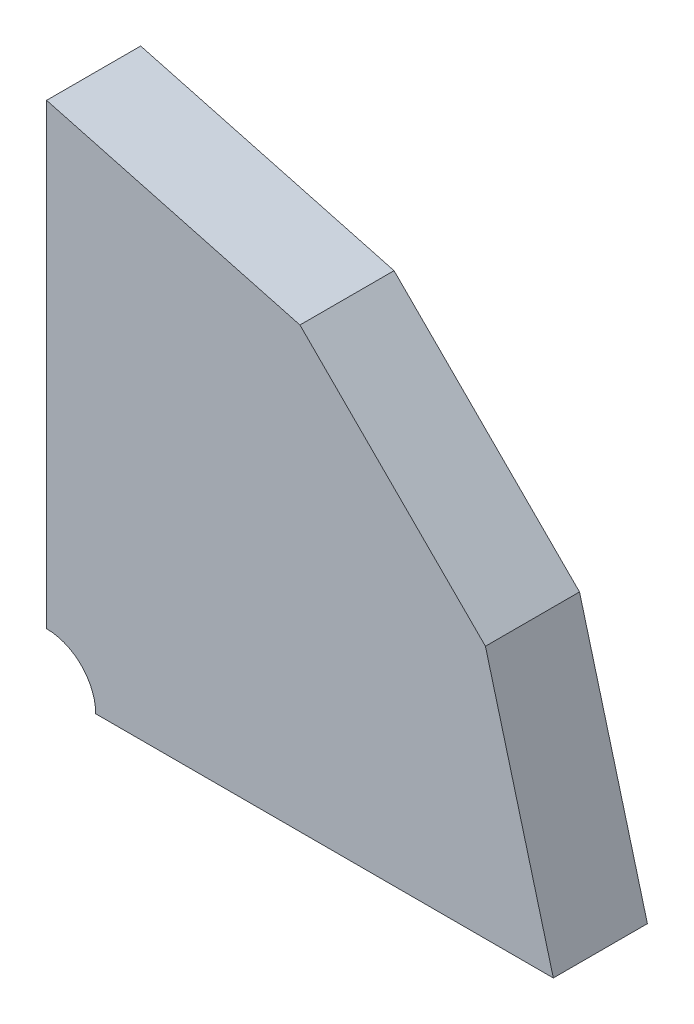
ISO-10303-21;
HEADER;
FILE_DESCRIPTION(('STEP AP214'),'2;1');
FILE_NAME('part.step','',(''),(''),'','','');
FILE_SCHEMA(('AUTOMOTIVE_DESIGN { 1 0 10303 214 1 1 1 1 }'));
ENDSEC;
DATA;
#1=APPLICATION_CONTEXT('core data for automotive mechanical design processes');
#2=APPLICATION_PROTOCOL_DEFINITION('international standard','automotive_design',2000,#1);
#3=PRODUCT_CONTEXT('',#1,'mechanical');
#4=PRODUCT('Part','Part','',(#3));
#5=PRODUCT_RELATED_PRODUCT_CATEGORY('part','',(#4));
#6=PRODUCT_DEFINITION_FORMATION('','',#4);
#7=PRODUCT_DEFINITION_CONTEXT('part definition',#1,'design');
#8=PRODUCT_DEFINITION('design','',#6,#7);
#9=PRODUCT_DEFINITION_SHAPE('','',#8);
#10=(LENGTH_UNIT() NAMED_UNIT(*) SI_UNIT(.MILLI.,.METRE.));
#11=(NAMED_UNIT(*) PLANE_ANGLE_UNIT() SI_UNIT($,.RADIAN.));
#12=(NAMED_UNIT(*) SI_UNIT($,.STERADIAN.) SOLID_ANGLE_UNIT());
#13=UNCERTAINTY_MEASURE_WITH_UNIT(LENGTH_MEASURE(1.E-05),#10,'distance_accuracy_value','');
#14=(GEOMETRIC_REPRESENTATION_CONTEXT(3) GLOBAL_UNCERTAINTY_ASSIGNED_CONTEXT((#13)) GLOBAL_UNIT_ASSIGNED_CONTEXT((#10,
#11,#12)) REPRESENTATION_CONTEXT('',''));
#15=CARTESIAN_POINT('',(0.,0.,0.));
#16=DIRECTION('',(0.,0.,1.));
#17=DIRECTION('',(1.,0.,0.));
#18=AXIS2_PLACEMENT_3D('',#15,#16,#17);
#19=CARTESIAN_POINT('',(-2.06853544642894E-11,-3.93812871202215E-07,1188.2200000819));
#20=DIRECTION('',(0.,0.,-1.));
#21=DIRECTION('',(-0.499999999999983,-0.866025403784448,0.));
#22=AXIS2_PLACEMENT_3D('',#19,#20,#21);
#23=CYLINDRICAL_SURFACE('',#22,533.4);
#24=DIRECTION('',(0.,0.,-1.));
#25=VECTOR('',#24,1.);
#26=CARTESIAN_POINT('',(533.399999999979,-3.81675066500359E-08,1188.2200000819));
#27=LINE('',#26,#25);
#28=CARTESIAN_POINT('',(533.399999999979,-3.81741830528863E-08,213.220000081901));
#29=VERTEX_POINT('',#28);
#30=CARTESIAN_POINT('',(533.399999999979,-3.81873867180188E-08,-1714.9999999181));
#31=VERTEX_POINT('',#30);
#32=EDGE_CURVE('E110',#29,#31,#27,.T.);
#33=ORIENTED_EDGE('',*,*,#32,.F.);
#34=CARTESIAN_POINT('',(-2.06853544642894E-11,-3.9381627539652E-07,213.220000081901));
#35=DIRECTION('',(0.,0.,-1.));
#36=DIRECTION('',(-1.,0.,0.));
#37=AXIS2_PLACEMENT_3D('',#34,#35,#36);
#38=CIRCLE('',#37,533.4);
#39=CARTESIAN_POINT('',(-5.37423249022792E-12,533.399999606184,213.220000081901));
#40=VERTEX_POINT('',#39);
#41=EDGE_CURVE('E57',#29,#40,#38,.F.);
#42=ORIENTED_EDGE('',*,*,#41,.T.);
#43=DIRECTION('',(0.,0.,-1.));
#44=VECTOR('',#43,1.);
#45=CARTESIAN_POINT('',(-3.46668881973511E-12,533.399999606187,1188.2200000819));
#46=LINE('',#45,#44);
#47=CARTESIAN_POINT('',(-9.14670824029732E-12,533.399999606177,-1714.9999999181));
#48=VERTEX_POINT('',#47);
#49=EDGE_CURVE('E198',#40,#48,#46,.T.);
#50=ORIENTED_EDGE('',*,*,#49,.T.);
#51=CARTESIAN_POINT('',(-2.06853544642893E-11,-3.93822974231739E-07,-1714.9999999181));
#52=DIRECTION('',(0.,0.,1.));
#53=DIRECTION('',(1.,0.,0.));
#54=AXIS2_PLACEMENT_3D('',#51,#52,#53);
#55=CIRCLE('',#54,533.4);
#56=EDGE_CURVE('E118',#48,#31,#55,.F.);
#57=ORIENTED_EDGE('',*,*,#56,.T.);
#58=EDGE_LOOP('',(#33,#42,#50,#57));
#59=FACE_BOUND('',#58,.T.);
#60=ADVANCED_FACE('F43',(#59),#23,.F.);
#61=CARTESIAN_POINT('',(-2.06886671161642E-11,-3.93822974231739E-07,-1714.9999999181));
#62=DIRECTION('',(0.,0.,1.));
#63=DIRECTION('',(1.,0.,0.));
#64=AXIS2_PLACEMENT_3D('',#61,#62,#63);
#65=PLANE('',#64);
#66=DIRECTION('',(1.,-7.15703845080556E-11,0.));
#67=VECTOR('',#66,1.);
#68=CARTESIAN_POINT('',(-2.0688638930943E-11,-1.17436214219295E-11,-1714.9999999181));
#69=LINE('',#68,#67);
#70=CARTESIAN_POINT('',(953.789538374289,-6.82746417592828E-08,-1714.9999999181));
#71=VERTEX_POINT('',#70);
#72=EDGE_CURVE('E120',#31,#71,#69,.T.);
#73=ORIENTED_EDGE('',*,*,#72,.F.);
#74=ORIENTED_EDGE('',*,*,#56,.F.);
#75=DIRECTION('',(0.,1.,0.));
#76=VECTOR('',#75,1.);
#77=CARTESIAN_POINT('',(-3.35532040058464E-12,-3.93822974231739E-07,-1714.9999999181));
#78=LINE('',#77,#76);
#79=CARTESIAN_POINT('',(-1.35509246747983E-11,953.789538067719,-1714.9999999181));
#80=VERTEX_POINT('',#79);
#81=EDGE_CURVE('E119',#48,#80,#78,.T.);
#82=ORIENTED_EDGE('',*,*,#81,.T.);
#83=DIRECTION('',(-0.965925826289072,0.258819045102508,0.));
#84=VECTOR('',#83,1.);
#85=CARTESIAN_POINT('',(-1136.96261538466,1258.43775268439,-1714.9999999181));
#86=LINE('',#85,#84);
#87=CARTESIAN_POINT('',(476.894769230738,826.005969777712,-1714.9999999181));
#88=VERTEX_POINT('',#87);
#89=EDGE_CURVE('E157',#88,#80,#86,.T.);
#90=ORIENTED_EDGE('',*,*,#89,.F.);
#91=DIRECTION('',(-0.707106781186556,0.707106781186539,0.));
#92=VECTOR('',#91,1.);
#93=CARTESIAN_POINT('',(-355.419631537206,1658.32037054564,-1714.9999999181));
#94=LINE('',#93,#92);
#95=CARTESIAN_POINT('',(826.005970171503,476.894768836957,-1714.9999999181));
#96=VERTEX_POINT('',#95);
#97=EDGE_CURVE('E148',#96,#88,#94,.T.);
#98=ORIENTED_EDGE('',*,*,#97,.F.);
#99=DIRECTION('',(-0.258819045102531,0.965925826289066,0.));
#100=VECTOR('',#99,1.);
#101=CARTESIAN_POINT('',(521.357755554805,1613.85738422157,-1714.9999999181));
#102=LINE('',#101,#100);
#103=EDGE_CURVE('E137',#71,#96,#102,.T.);
#104=ORIENTED_EDGE('',*,*,#103,.F.);
#105=EDGE_LOOP('',(#73,#74,#82,#90,#98,#104));
#106=FACE_BOUND('',#105,.T.);
#107=ADVANCED_FACE('F182',(#106),#65,.F.);
#108=CARTESIAN_POINT('',(0.,0.,213.220000081901));
#109=DIRECTION('',(0.,0.,-1.));
#110=DIRECTION('',(-1.,0.,0.));
#111=AXIS2_PLACEMENT_3D('',#108,#109,#110);
#112=PLANE('',#111);
#113=DIRECTION('',(-1.,7.15703845080556E-11,0.));
#114=VECTOR('',#113,1.);
#115=CARTESIAN_POINT('',(0.,1.46004370910642E-12,213.220000081901));
#116=LINE('',#115,#114);
#117=CARTESIAN_POINT('',(5501.63999999998,-3.93753030181189E-07,213.220000081901));
#118=VERTEX_POINT('',#117);
#119=EDGE_CURVE('E12',#118,#29,#116,.T.);
#120=ORIENTED_EDGE('',*,*,#119,.F.);
#121=DIRECTION('',(0.258819045102532,-0.965925826289066,0.));
#122=VECTOR('',#121,1.);
#123=CARTESIAN_POINT('',(4764.56000247657,2750.81999960624,213.220000081901));
#124=LINE('',#123,#122);
#125=CARTESIAN_POINT('',(4764.56000247657,2750.81999960625,213.220000081901));
#126=VERTEX_POINT('',#125);
#127=EDGE_CURVE('E200',#126,#118,#124,.T.);
#128=ORIENTED_EDGE('',*,*,#127,.F.);
#129=DIRECTION('',(0.707106781186556,-0.707106781186539,0.));
#130=VECTOR('',#129,1.);
#131=CARTESIAN_POINT('',(2750.81999999992,4764.56000208284,213.220000081901));
#132=LINE('',#131,#130);
#133=CARTESIAN_POINT('',(2750.81999999992,4764.56000208284,213.220000081901));
#134=VERTEX_POINT('',#133);
#135=EDGE_CURVE('E131',#134,#126,#132,.T.);
#136=ORIENTED_EDGE('',*,*,#135,.F.);
#137=DIRECTION('',(0.965925826289072,-0.258819045102508,0.));
#138=VECTOR('',#137,1.);
#139=CARTESIAN_POINT('',(-9.83718966127641E-11,5501.63999960618,213.220000081901));
#140=LINE('',#139,#138);
#141=CARTESIAN_POINT('',(-5.93168735115517E-11,5501.63999960618,213.220000081901));
#142=VERTEX_POINT('',#141);
#143=EDGE_CURVE('E126',#142,#134,#140,.T.);
#144=ORIENTED_EDGE('',*,*,#143,.F.);
#145=DIRECTION('',(0.,-1.,0.));
#146=VECTOR('',#145,1.);
#147=CARTESIAN_POINT('',(4.17155345208901E-13,0.,213.220000081901));
#148=LINE('',#147,#146);
#149=EDGE_CURVE('E50',#142,#40,#148,.T.);
#150=ORIENTED_EDGE('',*,*,#149,.T.);
#151=ORIENTED_EDGE('',*,*,#41,.F.);
#152=EDGE_LOOP('',(#120,#128,#136,#144,#150,#151));
#153=FACE_BOUND('',#152,.T.);
#154=ADVANCED_FACE('F123',(#153),#112,.F.);
#155=CARTESIAN_POINT('',(-9.75208480364212E-11,5501.63999960619,1188.22000008188));
#156=DIRECTION('',(-0.258819045102508,-0.965925826289072,0.));
#157=DIRECTION('',(0.965925826289072,-0.258819045102508,0.));
#158=AXIS2_PLACEMENT_3D('',#155,#156,#157);
#159=PLANE('',#158);
#160=DIRECTION('',(0.,0.,-1.));
#161=VECTOR('',#160,1.);
#162=CARTESIAN_POINT('',(-9.9515219346711E-11,5501.63999960619,1188.22000008188));
#163=LINE('',#162,#161);
#164=CARTESIAN_POINT('',(-6.13152749544113E-11,5501.63999960617,-808.219999918121));
#165=VERTEX_POINT('',#164);
#166=EDGE_CURVE('E163',#142,#165,#163,.T.);
#167=ORIENTED_EDGE('',*,*,#166,.F.);
#168=ORIENTED_EDGE('',*,*,#143,.T.);
#169=DIRECTION('',(0.,0.,-1.));
#170=VECTOR('',#169,1.);
#171=CARTESIAN_POINT('',(2750.81999999992,4764.56000208284,1188.22000008188));
#172=LINE('',#171,#170);
#173=CARTESIAN_POINT('',(2750.81999999992,4764.56000208284,-808.219999918117));
#174=VERTEX_POINT('',#173);
#175=EDGE_CURVE('E65',#134,#174,#172,.T.);
#176=ORIENTED_EDGE('',*,*,#175,.T.);
#177=DIRECTION('',(0.965925826289072,-0.258819045102508,0.));
#178=VECTOR('',#177,1.);
#179=CARTESIAN_POINT('',(-9.77428926413461E-11,5501.63999960618,-808.21999991812));
#180=LINE('',#179,#178);
#181=EDGE_CURVE('E151',#165,#174,#180,.T.);
#182=ORIENTED_EDGE('',*,*,#181,.F.);
#183=EDGE_LOOP('',(#167,#168,#176,#182));
#184=FACE_BOUND('',#183,.T.);
#185=ADVANCED_FACE('F172',(#184),#159,.F.);
#186=CARTESIAN_POINT('',(-9.77428926413461E-11,5501.63999960618,-808.21999991812));
#187=DIRECTION('',(-0.0523223715938377,-0.195269749160707,0.979352895790639));
#188=DIRECTION('',(0.,-0.980696207752423,-0.195537587435296));
#189=AXIS2_PLACEMENT_3D('',#186,#187,#188);
#190=PLANE('',#189);
#191=DIRECTION('',(0.4903481038762,0.849307829308667,0.195537587435296));
#192=VECTOR('',#191,1.);
#193=CARTESIAN_POINT('',(553.101831657599,958.000473796612,-1684.61068054543));
#194=LINE('',#193,#192);
#195=EDGE_CURVE('E153',#88,#174,#194,.T.);
#196=ORIENTED_EDGE('',*,*,#195,.F.);
#197=ORIENTED_EDGE('',*,*,#89,.T.);
#198=DIRECTION('',(0.,0.980696207752423,0.195537587435296));
#199=VECTOR('',#198,1.);
#200=CARTESIAN_POINT('',(-3.66810948925971E-11,1106.20366292144,-1684.61068054543));
#201=LINE('',#200,#199);
#202=EDGE_CURVE('E160',#80,#165,#201,.T.);
#203=ORIENTED_EDGE('',*,*,#202,.T.);
#204=ORIENTED_EDGE('',*,*,#181,.T.);
#205=EDGE_LOOP('',(#196,#197,#203,#204));
#206=FACE_BOUND('',#205,.T.);
#207=ADVANCED_FACE('F170',(#206),#190,.F.);
#208=CARTESIAN_POINT('',(2750.81999999992,4764.56000208284,1188.22000008188));
#209=DIRECTION('',(-0.707106781186539,-0.707106781186556,0.));
#210=DIRECTION('',(0.707106781186556,-0.707106781186539,0.));
#211=AXIS2_PLACEMENT_3D('',#208,#209,#210);
#212=PLANE('',#211);
#213=ORIENTED_EDGE('',*,*,#175,.F.);
#214=ORIENTED_EDGE('',*,*,#135,.T.);
#215=DIRECTION('',(0.,0.,-1.));
#216=VECTOR('',#215,1.);
#217=CARTESIAN_POINT('',(4764.56000247657,2750.81999960625,1188.22000008189));
#218=LINE('',#217,#216);
#219=CARTESIAN_POINT('',(4764.56000247657,2750.81999960624,-808.21999991811));
#220=VERTEX_POINT('',#219);
#221=EDGE_CURVE('E146',#126,#220,#218,.T.);
#222=ORIENTED_EDGE('',*,*,#221,.T.);
#223=DIRECTION('',(0.707106781186556,-0.707106781186539,0.));
#224=VECTOR('',#223,1.);
#225=CARTESIAN_POINT('',(2750.81999999992,4764.56000208284,-808.219999918117));
#226=LINE('',#225,#224);
#227=EDGE_CURVE('E140',#174,#220,#226,.T.);
#228=ORIENTED_EDGE('',*,*,#227,.F.);
#229=EDGE_LOOP('',(#213,#214,#222,#228));
#230=FACE_BOUND('',#229,.T.);
#231=ADVANCED_FACE('F179',(#230),#212,.F.);
#232=CARTESIAN_POINT('',(2750.81999999992,4764.56000208284,-808.219999918117));
#233=DIRECTION('',(-0.142947377566868,-0.142947377566868,0.979352895790639));
#234=DIRECTION('',(-0.4903481038762,-0.849307829308667,-0.195537587435296));
#235=AXIS2_PLACEMENT_3D('',#232,#233,#234);
#236=PLANE('',#235);
#237=DIRECTION('',(0.849307829308654,0.490348103876222,0.195537587435297));
#238=VECTOR('',#237,1.);
#239=CARTESIAN_POINT('',(958.0004741904,553.101831263821,-1684.61068054543));
#240=LINE('',#239,#238);
#241=EDGE_CURVE('E143',#96,#220,#240,.T.);
#242=ORIENTED_EDGE('',*,*,#241,.F.);
#243=ORIENTED_EDGE('',*,*,#97,.T.);
#244=ORIENTED_EDGE('',*,*,#195,.T.);
#245=ORIENTED_EDGE('',*,*,#227,.T.);
#246=EDGE_LOOP('',(#242,#243,#244,#245));
#247=FACE_BOUND('',#246,.T.);
#248=ADVANCED_FACE('F211',(#247),#236,.F.);
#249=CARTESIAN_POINT('',(4764.56000247657,2750.81999960624,1188.22000008189));
#250=DIRECTION('',(-0.965925826289066,-0.258819045102532,0.));
#251=DIRECTION('',(0.258819045102532,-0.965925826289066,0.));
#252=AXIS2_PLACEMENT_3D('',#249,#250,#251);
#253=PLANE('',#252);
#254=ORIENTED_EDGE('',*,*,#221,.F.);
#255=ORIENTED_EDGE('',*,*,#127,.T.);
#256=DIRECTION('',(0.,0.,-1.));
#257=VECTOR('',#256,1.);
#258=CARTESIAN_POINT('',(5501.63999999998,-3.93753030181188E-07,1188.2200000819));
#259=LINE('',#258,#257);
#260=CARTESIAN_POINT('',(5501.63999999998,-3.93760024586243E-07,-808.219999918099));
#261=VERTEX_POINT('',#260);
#262=EDGE_CURVE('E113',#118,#261,#259,.T.);
#263=ORIENTED_EDGE('',*,*,#262,.T.);
#264=DIRECTION('',(0.258819045102532,-0.965925826289066,0.));
#265=VECTOR('',#264,1.);
#266=CARTESIAN_POINT('',(4764.56000247657,2750.81999960624,-808.21999991811));
#267=LINE('',#266,#265);
#268=EDGE_CURVE('E125',#220,#261,#267,.T.);
#269=ORIENTED_EDGE('',*,*,#268,.F.);
#270=EDGE_LOOP('',(#254,#255,#263,#269));
#271=FACE_BOUND('',#270,.T.);
#272=ADVANCED_FACE('F207',(#271),#253,.F.);
#273=CARTESIAN_POINT('',(4764.56000247657,2750.81999960624,-808.21999991811));
#274=DIRECTION('',(-0.19526974916071,-0.0523223715938388,0.979352895790639));
#275=DIRECTION('',(-0.849307829308654,-0.490348103876222,-0.195537587435297));
#276=AXIS2_PLACEMENT_3D('',#273,#274,#275);
#277=PLANE('',#276);
#278=DIRECTION('',(0.980696207752423,0.,0.195537587435299));
#279=VECTOR('',#278,1.);
#280=CARTESIAN_POINT('',(1106.20366331524,-3.93810761778468E-07,-1684.61068054542));
#281=LINE('',#280,#279);
#282=EDGE_CURVE('E129',#71,#261,#281,.T.);
#283=ORIENTED_EDGE('',*,*,#282,.F.);
#284=ORIENTED_EDGE('',*,*,#103,.T.);
#285=ORIENTED_EDGE('',*,*,#241,.T.);
#286=ORIENTED_EDGE('',*,*,#268,.T.);
#287=EDGE_LOOP('',(#283,#284,#285,#286));
#288=FACE_BOUND('',#287,.T.);
#289=ADVANCED_FACE('F209',(#288),#277,.F.);
#290=CARTESIAN_POINT('',(0.,0.,0.));
#291=DIRECTION('',(1.,0.,0.));
#292=DIRECTION('',(0.,1.,0.));
#293=AXIS2_PLACEMENT_3D('',#290,#291,#292);
#294=PLANE('',#293);
#295=ORIENTED_EDGE('',*,*,#149,.F.);
#296=ORIENTED_EDGE('',*,*,#166,.T.);
#297=ORIENTED_EDGE('',*,*,#202,.F.);
#298=ORIENTED_EDGE('',*,*,#81,.F.);
#299=ORIENTED_EDGE('',*,*,#49,.F.);
#300=EDGE_LOOP('',(#295,#296,#297,#298,#299));
#301=FACE_BOUND('',#300,.T.);
#302=ADVANCED_FACE('F167',(#301),#294,.F.);
#303=CARTESIAN_POINT('',(0.,0.,0.));
#304=DIRECTION('',(-7.15703845080556E-11,-1.,0.));
#305=DIRECTION('',(1.,-7.15703845080556E-11,0.));
#306=AXIS2_PLACEMENT_3D('',#303,#304,#305);
#307=PLANE('',#306);
#308=ORIENTED_EDGE('',*,*,#32,.T.);
#309=ORIENTED_EDGE('',*,*,#72,.T.);
#310=ORIENTED_EDGE('',*,*,#282,.T.);
#311=ORIENTED_EDGE('',*,*,#262,.F.);
#312=ORIENTED_EDGE('',*,*,#119,.T.);
#313=EDGE_LOOP('',(#308,#309,#310,#311,#312));
#314=FACE_BOUND('',#313,.T.);
#315=ADVANCED_FACE('F109',(#314),#307,.T.);
#316=CLOSED_SHELL('',(#60,#107,#154,#185,#207,#231,#248,#272,#289,#302,#315));
#317=MANIFOLD_SOLID_BREP('B2',#316);
#318=ADVANCED_BREP_SHAPE_REPRESENTATION('',(#18,#317),#14);
#319=SHAPE_DEFINITION_REPRESENTATION(#9,#318);
ENDSEC;
END-ISO-10303-21;
